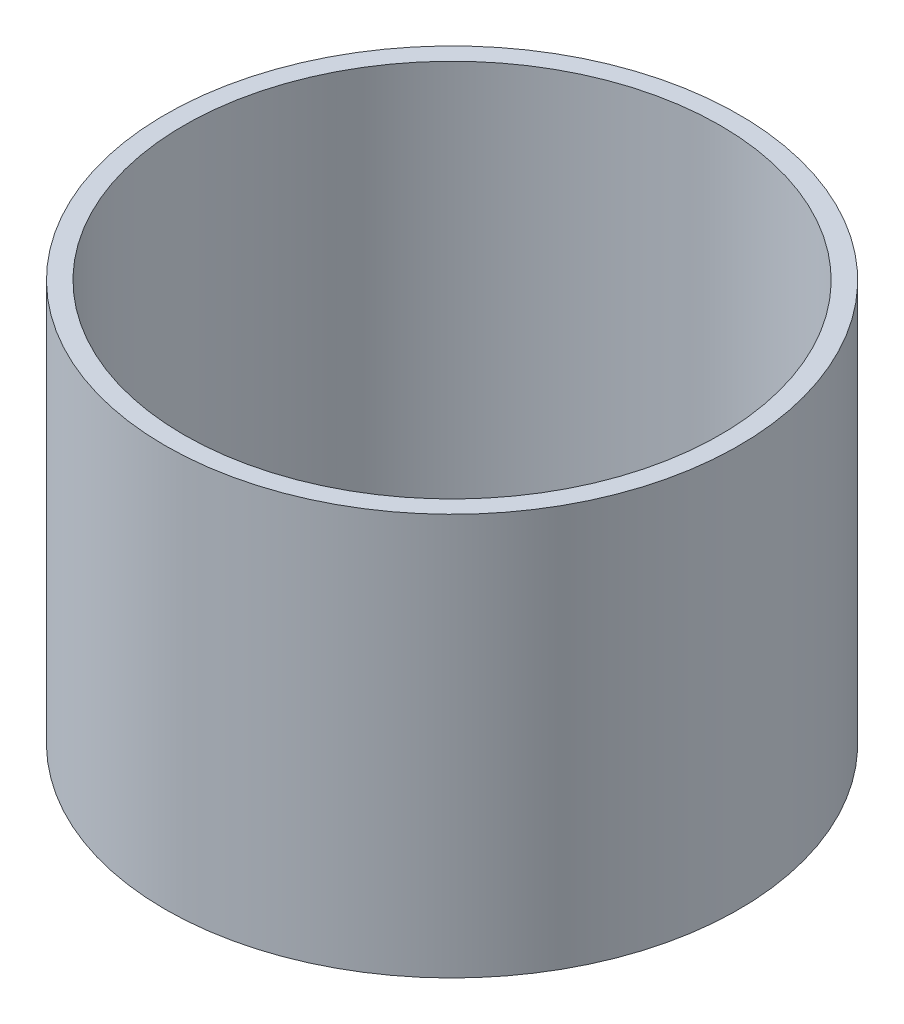
ISO-10303-21;
HEADER;
FILE_DESCRIPTION(('STEP AP214'),'2;1');
FILE_NAME('part.step','',(''),(''),'','','');
FILE_SCHEMA(('AUTOMOTIVE_DESIGN { 1 0 10303 214 1 1 1 1 }'));
ENDSEC;
DATA;
#1=APPLICATION_CONTEXT('core data for automotive mechanical design processes');
#2=APPLICATION_PROTOCOL_DEFINITION('international standard','automotive_design',2000,#1);
#3=PRODUCT_CONTEXT('',#1,'mechanical');
#4=PRODUCT('Part','Part','',(#3));
#5=PRODUCT_RELATED_PRODUCT_CATEGORY('part','',(#4));
#6=PRODUCT_DEFINITION_FORMATION('','',#4);
#7=PRODUCT_DEFINITION_CONTEXT('part definition',#1,'design');
#8=PRODUCT_DEFINITION('design','',#6,#7);
#9=PRODUCT_DEFINITION_SHAPE('','',#8);
#10=(LENGTH_UNIT() NAMED_UNIT(*) SI_UNIT(.MILLI.,.METRE.));
#11=(NAMED_UNIT(*) PLANE_ANGLE_UNIT() SI_UNIT($,.RADIAN.));
#12=(NAMED_UNIT(*) SI_UNIT($,.STERADIAN.) SOLID_ANGLE_UNIT());
#13=UNCERTAINTY_MEASURE_WITH_UNIT(LENGTH_MEASURE(1.E-05),#10,'distance_accuracy_value','');
#14=(GEOMETRIC_REPRESENTATION_CONTEXT(3) GLOBAL_UNCERTAINTY_ASSIGNED_CONTEXT((#13)) GLOBAL_UNIT_ASSIGNED_CONTEXT((#10,
#11,#12)) REPRESENTATION_CONTEXT('',''));
#15=CARTESIAN_POINT('',(0.,0.,0.));
#16=DIRECTION('',(0.,0.,1.));
#17=DIRECTION('',(1.,0.,0.));
#18=AXIS2_PLACEMENT_3D('',#15,#16,#17);
#19=CARTESIAN_POINT('',(0.,57.15,0.));
#20=DIRECTION('',(0.,1.,0.));
#21=DIRECTION('',(0.,0.,1.));
#22=AXIS2_PLACEMENT_3D('',#19,#20,#21);
#23=PLANE('',#22);
#24=CARTESIAN_POINT('',(0.,57.15,0.));
#25=DIRECTION('',(0.,1.,0.));
#26=DIRECTION('',(0.,0.,1.));
#27=AXIS2_PLACEMENT_3D('',#24,#25,#26);
#28=CIRCLE('',#27,40.8178);
#29=CARTESIAN_POINT('',(0.,57.15,40.8178));
#30=VERTEX_POINT('',#29);
#31=EDGE_CURVE('E10',#30,#30,#28,.T.);
#32=ORIENTED_EDGE('',*,*,#31,.T.);
#33=EDGE_LOOP('',(#32));
#34=FACE_BOUND('',#33,.T.);
#35=CARTESIAN_POINT('',(0.,57.15,0.));
#36=DIRECTION('',(0.,1.,0.));
#37=DIRECTION('',(0.,0.,1.));
#38=AXIS2_PLACEMENT_3D('',#35,#36,#37);
#39=CIRCLE('',#38,38.1508);
#40=CARTESIAN_POINT('',(0.,57.15,38.1508));
#41=VERTEX_POINT('',#40);
#42=EDGE_CURVE('E48',#41,#41,#39,.T.);
#43=ORIENTED_EDGE('',*,*,#42,.F.);
#44=EDGE_LOOP('',(#43));
#45=FACE_BOUND('',#44,.T.);
#46=ADVANCED_FACE('F37',(#34,#45),#23,.T.);
#47=CARTESIAN_POINT('',(0.,0.,0.));
#48=DIRECTION('',(0.,1.,0.));
#49=DIRECTION('',(0.,0.,1.));
#50=AXIS2_PLACEMENT_3D('',#47,#48,#49);
#51=PLANE('',#50);
#52=CARTESIAN_POINT('',(0.,0.,0.));
#53=DIRECTION('',(0.,1.,0.));
#54=DIRECTION('',(0.,0.,1.));
#55=AXIS2_PLACEMENT_3D('',#52,#53,#54);
#56=CIRCLE('',#55,40.8178);
#57=CARTESIAN_POINT('',(0.,0.,40.8178));
#58=VERTEX_POINT('',#57);
#59=EDGE_CURVE('E41',#58,#58,#56,.T.);
#60=ORIENTED_EDGE('',*,*,#59,.F.);
#61=EDGE_LOOP('',(#60));
#62=FACE_BOUND('',#61,.T.);
#63=CARTESIAN_POINT('',(0.,0.,0.));
#64=DIRECTION('',(0.,1.,0.));
#65=DIRECTION('',(0.,0.,1.));
#66=AXIS2_PLACEMENT_3D('',#63,#64,#65);
#67=CIRCLE('',#66,38.1508);
#68=CARTESIAN_POINT('',(0.,0.,38.1508));
#69=VERTEX_POINT('',#68);
#70=EDGE_CURVE('E50',#69,#69,#67,.T.);
#71=ORIENTED_EDGE('',*,*,#70,.T.);
#72=EDGE_LOOP('',(#71));
#73=FACE_BOUND('',#72,.T.);
#74=ADVANCED_FACE('F60',(#62,#73),#51,.F.);
#75=CARTESIAN_POINT('',(0.,57.15,0.));
#76=DIRECTION('',(0.,-1.,0.));
#77=DIRECTION('',(0.,0.,-1.));
#78=AXIS2_PLACEMENT_3D('',#75,#76,#77);
#79=CYLINDRICAL_SURFACE('',#78,40.8178);
#80=ORIENTED_EDGE('',*,*,#31,.F.);
#81=EDGE_LOOP('',(#80));
#82=FACE_BOUND('',#81,.T.);
#83=ORIENTED_EDGE('',*,*,#59,.T.);
#84=EDGE_LOOP('',(#83));
#85=FACE_BOUND('',#84,.T.);
#86=ADVANCED_FACE('F39',(#82,#85),#79,.T.);
#87=CARTESIAN_POINT('',(0.,57.15,0.));
#88=DIRECTION('',(0.,-1.,0.));
#89=DIRECTION('',(0.,0.,-1.));
#90=AXIS2_PLACEMENT_3D('',#87,#88,#89);
#91=CYLINDRICAL_SURFACE('',#90,38.1508);
#92=ORIENTED_EDGE('',*,*,#42,.T.);
#93=EDGE_LOOP('',(#92));
#94=FACE_BOUND('',#93,.T.);
#95=ORIENTED_EDGE('',*,*,#70,.F.);
#96=EDGE_LOOP('',(#95));
#97=FACE_BOUND('',#96,.T.);
#98=ADVANCED_FACE('F56',(#94,#97),#91,.F.);
#99=CLOSED_SHELL('',(#46,#74,#86,#98));
#100=MANIFOLD_SOLID_BREP('B2',#99);
#101=ADVANCED_BREP_SHAPE_REPRESENTATION('',(#18,#100),#14);
#102=SHAPE_DEFINITION_REPRESENTATION(#9,#101);
ENDSEC;
END-ISO-10303-21;
